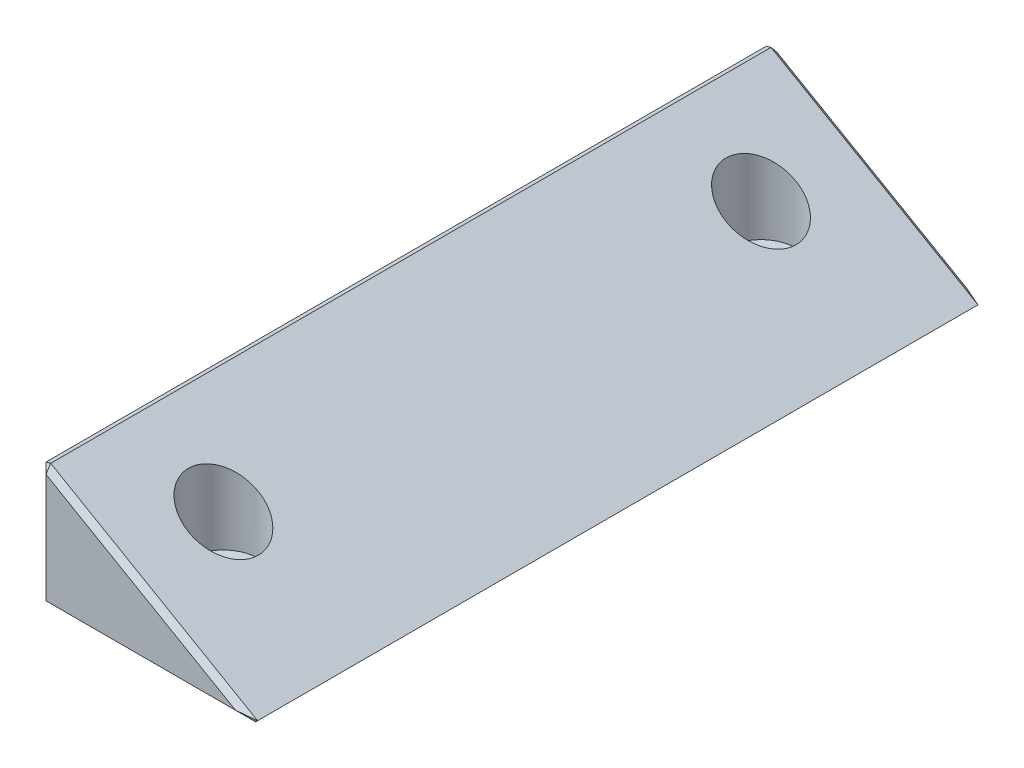
ISO-10303-21;
HEADER;
FILE_DESCRIPTION(('STEP AP214'),'2;1');
FILE_NAME('part.step','',(''),(''),'','','');
FILE_SCHEMA(('AUTOMOTIVE_DESIGN { 1 0 10303 214 1 1 1 1 }'));
ENDSEC;
DATA;
#1=APPLICATION_CONTEXT('core data for automotive mechanical design processes');
#2=APPLICATION_PROTOCOL_DEFINITION('international standard','automotive_design',2000,#1);
#3=PRODUCT_CONTEXT('',#1,'mechanical');
#4=PRODUCT('Part','Part','',(#3));
#5=PRODUCT_RELATED_PRODUCT_CATEGORY('part','',(#4));
#6=PRODUCT_DEFINITION_FORMATION('','',#4);
#7=PRODUCT_DEFINITION_CONTEXT('part definition',#1,'design');
#8=PRODUCT_DEFINITION('design','',#6,#7);
#9=PRODUCT_DEFINITION_SHAPE('','',#8);
#10=(LENGTH_UNIT() NAMED_UNIT(*) SI_UNIT(.MILLI.,.METRE.));
#11=(NAMED_UNIT(*) PLANE_ANGLE_UNIT() SI_UNIT($,.RADIAN.));
#12=(NAMED_UNIT(*) SI_UNIT($,.STERADIAN.) SOLID_ANGLE_UNIT());
#13=UNCERTAINTY_MEASURE_WITH_UNIT(LENGTH_MEASURE(1.E-05),#10,'distance_accuracy_value','');
#14=(GEOMETRIC_REPRESENTATION_CONTEXT(3) GLOBAL_UNCERTAINTY_ASSIGNED_CONTEXT((#13)) GLOBAL_UNIT_ASSIGNED_CONTEXT((#10,
#11,#12)) REPRESENTATION_CONTEXT('',''));
#15=CARTESIAN_POINT('',(0.,0.,0.));
#16=DIRECTION('',(0.,0.,1.));
#17=DIRECTION('',(1.,0.,0.));
#18=AXIS2_PLACEMENT_3D('',#15,#16,#17);
#19=CARTESIAN_POINT('',(20.,-11.5470053837923,34.));
#20=DIRECTION('',(-0.499999999999994,-0.866025403784442,0.));
#21=DIRECTION('',(0.866025403784442,-0.499999999999994,0.));
#22=AXIS2_PLACEMENT_3D('',#19,#20,#21);
#23=PLANE('',#22);
#24=DIRECTION('',(0.,0.,-1.));
#25=VECTOR('',#24,1.);
#26=CARTESIAN_POINT('',(19.6830127018922,-11.3639926819001,34.));
#27=LINE('',#26,#25);
#28=CARTESIAN_POINT('',(19.6830127018922,-11.3639926819001,33.5));
#29=VERTEX_POINT('',#28);
#30=CARTESIAN_POINT('',(19.6830127018922,-11.3639926819001,-33.5));
#31=VERTEX_POINT('',#30);
#32=EDGE_CURVE('E230',#29,#31,#27,.T.);
#33=ORIENTED_EDGE('',*,*,#32,.T.);
#34=DIRECTION('',(-0.866025403784442,0.499999999999994,0.));
#35=VECTOR('',#34,1.);
#36=CARTESIAN_POINT('',(20.,-11.5470053837923,-33.5));
#37=LINE('',#36,#35);
#38=CARTESIAN_POINT('',(0.433012701892221,-0.249999999999995,-33.5));
#39=VERTEX_POINT('',#38);
#40=EDGE_CURVE('E237',#31,#39,#37,.T.);
#41=ORIENTED_EDGE('',*,*,#40,.T.);
#42=DIRECTION('',(0.,0.,1.));
#43=VECTOR('',#42,1.);
#44=CARTESIAN_POINT('',(0.433012701892221,-0.249999999999995,34.));
#45=LINE('',#44,#43);
#46=CARTESIAN_POINT('',(0.433012701892221,-0.249999999999995,33.5));
#47=VERTEX_POINT('',#46);
#48=EDGE_CURVE('E233',#39,#47,#45,.T.);
#49=ORIENTED_EDGE('',*,*,#48,.T.);
#50=DIRECTION('',(0.866025403784442,-0.499999999999994,0.));
#51=VECTOR('',#50,1.);
#52=CARTESIAN_POINT('',(20.,-11.5470053837923,33.5));
#53=LINE('',#52,#51);
#54=EDGE_CURVE('E227',#47,#29,#53,.T.);
#55=ORIENTED_EDGE('',*,*,#54,.T.);
#56=EDGE_LOOP('',(#33,#41,#49,#55));
#57=FACE_BOUND('',#56,.T.);
#58=CARTESIAN_POINT('',(8.,-4.61880215351693,25.));
#59=DIRECTION('',(-0.499999999999994,-0.866025403784442,0.));
#60=DIRECTION('',(-0.866025403784442,0.499999999999994,0.));
#61=AXIS2_PLACEMENT_3D('',#58,#59,#60);
#62=ELLIPSE('',#61,3.75277674973255,3.25);
#63=CARTESIAN_POINT('',(4.75,-2.74241377865068,25.));
#64=VERTEX_POINT('',#63);
#65=EDGE_CURVE('E206',#64,#64,#62,.T.);
#66=ORIENTED_EDGE('',*,*,#65,.T.);
#67=EDGE_LOOP('',(#66));
#68=FACE_BOUND('',#67,.T.);
#69=CARTESIAN_POINT('',(8.,-4.61880215351693,-25.));
#70=DIRECTION('',(-0.499999999999994,-0.866025403784442,0.));
#71=DIRECTION('',(-0.866025403784442,0.499999999999994,0.));
#72=AXIS2_PLACEMENT_3D('',#69,#70,#71);
#73=ELLIPSE('',#72,3.75277674973255,3.25);
#74=CARTESIAN_POINT('',(4.75,-2.74241377865068,-25.));
#75=VERTEX_POINT('',#74);
#76=EDGE_CURVE('E143',#75,#75,#73,.T.);
#77=ORIENTED_EDGE('',*,*,#76,.T.);
#78=EDGE_LOOP('',(#77));
#79=FACE_BOUND('',#78,.T.);
#80=ADVANCED_FACE('F43',(#57,#68,#79),#23,.F.);
#81=CARTESIAN_POINT('',(0.,0.,34.));
#82=DIRECTION('',(1.,0.,0.));
#83=DIRECTION('',(0.,0.,-1.));
#84=AXIS2_PLACEMENT_3D('',#81,#82,#83);
#85=PLANE('',#84);
#86=DIRECTION('',(0.,1.,0.));
#87=VECTOR('',#86,1.);
#88=CARTESIAN_POINT('',(0.,0.,33.5));
#89=LINE('',#88,#87);
#90=CARTESIAN_POINT('',(0.,-11.0470053837923,33.5));
#91=VERTEX_POINT('',#90);
#92=CARTESIAN_POINT('',(0.,-0.366025403784432,33.5));
#93=VERTEX_POINT('',#92);
#94=EDGE_CURVE('E130',#91,#93,#89,.T.);
#95=ORIENTED_EDGE('',*,*,#94,.T.);
#96=DIRECTION('',(0.,0.,-1.));
#97=VECTOR('',#96,1.);
#98=CARTESIAN_POINT('',(0.,-0.366025403784432,34.));
#99=LINE('',#98,#97);
#100=CARTESIAN_POINT('',(0.,-0.366025403784432,-33.5));
#101=VERTEX_POINT('',#100);
#102=EDGE_CURVE('E126',#93,#101,#99,.T.);
#103=ORIENTED_EDGE('',*,*,#102,.T.);
#104=DIRECTION('',(0.,-1.,0.));
#105=VECTOR('',#104,1.);
#106=CARTESIAN_POINT('',(0.,0.,-33.5));
#107=LINE('',#106,#105);
#108=CARTESIAN_POINT('',(0.,-11.0470053837923,-33.5));
#109=VERTEX_POINT('',#108);
#110=EDGE_CURVE('E120',#101,#109,#107,.T.);
#111=ORIENTED_EDGE('',*,*,#110,.T.);
#112=DIRECTION('',(0.,0.,1.));
#113=VECTOR('',#112,1.);
#114=CARTESIAN_POINT('',(0.,-11.0470053837923,34.));
#115=LINE('',#114,#113);
#116=EDGE_CURVE('E123',#109,#91,#115,.T.);
#117=ORIENTED_EDGE('',*,*,#116,.T.);
#118=EDGE_LOOP('',(#95,#103,#111,#117));
#119=FACE_BOUND('',#118,.T.);
#120=ADVANCED_FACE('F122',(#119),#85,.F.);
#121=CARTESIAN_POINT('',(0.,-11.5470053837923,34.));
#122=DIRECTION('',(0.,1.,0.));
#123=DIRECTION('',(0.,0.,1.));
#124=AXIS2_PLACEMENT_3D('',#121,#122,#123);
#125=PLANE('',#124);
#126=CARTESIAN_POINT('',(8.,-11.5470053837923,-25.));
#127=DIRECTION('',(0.,1.,0.));
#128=DIRECTION('',(0.,0.,1.));
#129=AXIS2_PLACEMENT_3D('',#126,#127,#128);
#130=CIRCLE('',#129,2.2);
#131=CARTESIAN_POINT('',(8.,-11.5470053837923,-22.8));
#132=VERTEX_POINT('',#131);
#133=EDGE_CURVE('E257',#132,#132,#130,.T.);
#134=ORIENTED_EDGE('',*,*,#133,.T.);
#135=EDGE_LOOP('',(#134));
#136=FACE_BOUND('',#135,.T.);
#137=CARTESIAN_POINT('',(8.,-11.5470053837923,25.));
#138=DIRECTION('',(0.,1.,0.));
#139=DIRECTION('',(0.,0.,1.));
#140=AXIS2_PLACEMENT_3D('',#137,#138,#139);
#141=CIRCLE('',#140,2.2);
#142=CARTESIAN_POINT('',(8.,-11.5470053837923,27.2));
#143=VERTEX_POINT('',#142);
#144=EDGE_CURVE('E253',#143,#143,#141,.T.);
#145=ORIENTED_EDGE('',*,*,#144,.T.);
#146=EDGE_LOOP('',(#145));
#147=FACE_BOUND('',#146,.T.);
#148=DIRECTION('',(1.,0.,0.));
#149=VECTOR('',#148,1.);
#150=CARTESIAN_POINT('',(0.,-11.5470053837923,-33.5));
#151=LINE('',#150,#149);
#152=CARTESIAN_POINT('',(0.5,-11.5470053837923,-33.5));
#153=VERTEX_POINT('',#152);
#154=CARTESIAN_POINT('',(19.5,-11.5470053837923,-33.5));
#155=VERTEX_POINT('',#154);
#156=EDGE_CURVE('E246',#153,#155,#151,.T.);
#157=ORIENTED_EDGE('',*,*,#156,.T.);
#158=DIRECTION('',(0.,0.,1.));
#159=VECTOR('',#158,1.);
#160=CARTESIAN_POINT('',(19.5,-11.5470053837923,34.));
#161=LINE('',#160,#159);
#162=CARTESIAN_POINT('',(19.5,-11.5470053837923,33.5));
#163=VERTEX_POINT('',#162);
#164=EDGE_CURVE('E249',#155,#163,#161,.T.);
#165=ORIENTED_EDGE('',*,*,#164,.T.);
#166=DIRECTION('',(-1.,0.,0.));
#167=VECTOR('',#166,1.);
#168=CARTESIAN_POINT('',(0.,-11.5470053837923,33.5));
#169=LINE('',#168,#167);
#170=CARTESIAN_POINT('',(0.5,-11.5470053837923,33.5));
#171=VERTEX_POINT('',#170);
#172=EDGE_CURVE('E240',#163,#171,#169,.T.);
#173=ORIENTED_EDGE('',*,*,#172,.T.);
#174=DIRECTION('',(0.,0.,-1.));
#175=VECTOR('',#174,1.);
#176=CARTESIAN_POINT('',(0.5,-11.5470053837923,34.));
#177=LINE('',#176,#175);
#178=EDGE_CURVE('E243',#171,#153,#177,.T.);
#179=ORIENTED_EDGE('',*,*,#178,.T.);
#180=EDGE_LOOP('',(#157,#165,#173,#179));
#181=FACE_BOUND('',#180,.T.);
#182=ADVANCED_FACE('F334',(#136,#147,#181),#125,.F.);
#183=CARTESIAN_POINT('',(0.,0.,34.));
#184=DIRECTION('',(0.,0.,1.));
#185=DIRECTION('',(1.,0.,0.));
#186=AXIS2_PLACEMENT_3D('',#183,#184,#185);
#187=PLANE('',#186);
#188=DIRECTION('',(-0.866025403784442,0.499999999999995,0.));
#189=VECTOR('',#188,1.);
#190=CARTESIAN_POINT('',(-0.249999999999997,-0.43301270189222,34.));
#191=LINE('',#190,#189);
#192=CARTESIAN_POINT('',(18.1339745962155,-11.0470053837923,34.));
#193=VERTEX_POINT('',#192);
#194=CARTESIAN_POINT('',(0.5,-0.866025403784431,34.));
#195=VERTEX_POINT('',#194);
#196=EDGE_CURVE('E269',#193,#195,#191,.T.);
#197=ORIENTED_EDGE('',*,*,#196,.T.);
#198=DIRECTION('',(0.,-1.,0.));
#199=VECTOR('',#198,1.);
#200=CARTESIAN_POINT('',(0.5,-11.5470053837923,34.));
#201=LINE('',#200,#199);
#202=CARTESIAN_POINT('',(0.5,-11.0470053837923,34.));
#203=VERTEX_POINT('',#202);
#204=EDGE_CURVE('E275',#195,#203,#201,.T.);
#205=ORIENTED_EDGE('',*,*,#204,.T.);
#206=DIRECTION('',(1.,0.,0.));
#207=VECTOR('',#206,1.);
#208=CARTESIAN_POINT('',(20.,-11.0470053837923,34.));
#209=LINE('',#208,#207);
#210=EDGE_CURVE('E272',#203,#193,#209,.T.);
#211=ORIENTED_EDGE('',*,*,#210,.T.);
#212=EDGE_LOOP('',(#197,#205,#211));
#213=FACE_BOUND('',#212,.T.);
#214=ADVANCED_FACE('F324',(#213),#187,.T.);
#215=CARTESIAN_POINT('',(0.,0.,-34.));
#216=DIRECTION('',(0.,0.,1.));
#217=DIRECTION('',(1.,0.,0.));
#218=AXIS2_PLACEMENT_3D('',#215,#216,#217);
#219=PLANE('',#218);
#220=DIRECTION('',(-1.,0.,0.));
#221=VECTOR('',#220,1.);
#222=CARTESIAN_POINT('',(0.,-11.0470053837923,-34.));
#223=LINE('',#222,#221);
#224=CARTESIAN_POINT('',(18.1339745962155,-11.0470053837923,-34.));
#225=VERTEX_POINT('',#224);
#226=CARTESIAN_POINT('',(0.5,-11.0470053837923,-34.));
#227=VERTEX_POINT('',#226);
#228=EDGE_CURVE('E69',#225,#227,#223,.T.);
#229=ORIENTED_EDGE('',*,*,#228,.T.);
#230=DIRECTION('',(0.,1.,0.));
#231=VECTOR('',#230,1.);
#232=CARTESIAN_POINT('',(0.5,0.,-34.));
#233=LINE('',#232,#231);
#234=CARTESIAN_POINT('',(0.5,-0.866025403784429,-34.));
#235=VERTEX_POINT('',#234);
#236=EDGE_CURVE('E11',#227,#235,#233,.T.);
#237=ORIENTED_EDGE('',*,*,#236,.T.);
#238=DIRECTION('',(0.866025403784442,-0.499999999999995,0.));
#239=VECTOR('',#238,1.);
#240=CARTESIAN_POINT('',(-0.249999999999996,-0.433012701892218,-34.));
#241=LINE('',#240,#239);
#242=EDGE_CURVE('E54',#235,#225,#241,.T.);
#243=ORIENTED_EDGE('',*,*,#242,.T.);
#244=EDGE_LOOP('',(#229,#237,#243));
#245=FACE_BOUND('',#244,.T.);
#246=ADVANCED_FACE('F321',(#245),#219,.F.);
#247=CARTESIAN_POINT('',(8.,0.,-25.));
#248=DIRECTION('',(0.,1.,0.));
#249=DIRECTION('',(0.,0.,1.));
#250=AXIS2_PLACEMENT_3D('',#247,#248,#249);
#251=CYLINDRICAL_SURFACE('',#250,3.25);
#252=CARTESIAN_POINT('',(8.,-10.,-25.));
#253=DIRECTION('',(0.,1.,0.));
#254=DIRECTION('',(0.,0.,1.));
#255=AXIS2_PLACEMENT_3D('',#252,#253,#254);
#256=CIRCLE('',#255,3.25);
#257=CARTESIAN_POINT('',(8.,-10.,-21.75));
#258=VERTEX_POINT('',#257);
#259=EDGE_CURVE('E209',#258,#258,#256,.T.);
#260=ORIENTED_EDGE('',*,*,#259,.F.);
#261=EDGE_LOOP('',(#260));
#262=FACE_BOUND('',#261,.T.);
#263=ORIENTED_EDGE('',*,*,#76,.F.);
#264=EDGE_LOOP('',(#263));
#265=FACE_BOUND('',#264,.T.);
#266=ADVANCED_FACE('F323',(#262,#265),#251,.F.);
#267=CARTESIAN_POINT('',(8.,0.,-25.));
#268=DIRECTION('',(0.,1.,0.));
#269=DIRECTION('',(0.,0.,1.));
#270=AXIS2_PLACEMENT_3D('',#267,#268,#269);
#271=CYLINDRICAL_SURFACE('',#270,1.7);
#272=CARTESIAN_POINT('',(8.,-11.0470053837923,-25.));
#273=DIRECTION('',(0.,1.,0.));
#274=DIRECTION('',(0.,0.,1.));
#275=AXIS2_PLACEMENT_3D('',#272,#273,#274);
#276=CIRCLE('',#275,1.7);
#277=CARTESIAN_POINT('',(8.,-11.0470053837923,-23.3));
#278=VERTEX_POINT('',#277);
#279=EDGE_CURVE('E261',#278,#278,#276,.F.);
#280=ORIENTED_EDGE('',*,*,#279,.T.);
#281=EDGE_LOOP('',(#280));
#282=FACE_BOUND('',#281,.T.);
#283=CARTESIAN_POINT('',(8.,-10.,-25.));
#284=DIRECTION('',(0.,1.,0.));
#285=DIRECTION('',(0.,0.,1.));
#286=AXIS2_PLACEMENT_3D('',#283,#284,#285);
#287=CIRCLE('',#286,1.7);
#288=CARTESIAN_POINT('',(8.,-10.,-23.3));
#289=VERTEX_POINT('',#288);
#290=EDGE_CURVE('E213',#289,#289,#287,.T.);
#291=ORIENTED_EDGE('',*,*,#290,.T.);
#292=EDGE_LOOP('',(#291));
#293=FACE_BOUND('',#292,.T.);
#294=ADVANCED_FACE('F331',(#282,#293),#271,.F.);
#295=CARTESIAN_POINT('',(9.69999999999999,-10.,-25.));
#296=DIRECTION('',(0.,-1.,0.));
#297=DIRECTION('',(0.,0.,-1.));
#298=AXIS2_PLACEMENT_3D('',#295,#296,#297);
#299=PLANE('',#298);
#300=ORIENTED_EDGE('',*,*,#290,.F.);
#301=EDGE_LOOP('',(#300));
#302=FACE_BOUND('',#301,.T.);
#303=ORIENTED_EDGE('',*,*,#259,.T.);
#304=EDGE_LOOP('',(#303));
#305=FACE_BOUND('',#304,.T.);
#306=ADVANCED_FACE('F487',(#302,#305),#299,.F.);
#307=CARTESIAN_POINT('',(8.,0.,25.));
#308=DIRECTION('',(0.,1.,0.));
#309=DIRECTION('',(0.,0.,1.));
#310=AXIS2_PLACEMENT_3D('',#307,#308,#309);
#311=CYLINDRICAL_SURFACE('',#310,3.25);
#312=CARTESIAN_POINT('',(8.,-10.,25.));
#313=DIRECTION('',(0.,1.,0.));
#314=DIRECTION('',(0.,0.,1.));
#315=AXIS2_PLACEMENT_3D('',#312,#313,#314);
#316=CIRCLE('',#315,3.25);
#317=CARTESIAN_POINT('',(8.,-10.,28.25));
#318=VERTEX_POINT('',#317);
#319=EDGE_CURVE('E195',#318,#318,#316,.T.);
#320=ORIENTED_EDGE('',*,*,#319,.F.);
#321=EDGE_LOOP('',(#320));
#322=FACE_BOUND('',#321,.T.);
#323=ORIENTED_EDGE('',*,*,#65,.F.);
#324=EDGE_LOOP('',(#323));
#325=FACE_BOUND('',#324,.T.);
#326=ADVANCED_FACE('F497',(#322,#325),#311,.F.);
#327=CARTESIAN_POINT('',(8.,0.,25.));
#328=DIRECTION('',(0.,1.,0.));
#329=DIRECTION('',(0.,0.,1.));
#330=AXIS2_PLACEMENT_3D('',#327,#328,#329);
#331=CYLINDRICAL_SURFACE('',#330,1.7);
#332=CARTESIAN_POINT('',(8.,-11.0470053837923,25.));
#333=DIRECTION('',(0.,1.,0.));
#334=DIRECTION('',(0.,0.,1.));
#335=AXIS2_PLACEMENT_3D('',#332,#333,#334);
#336=CIRCLE('',#335,1.7);
#337=CARTESIAN_POINT('',(8.,-11.0470053837923,26.7));
#338=VERTEX_POINT('',#337);
#339=EDGE_CURVE('E265',#338,#338,#336,.F.);
#340=ORIENTED_EDGE('',*,*,#339,.T.);
#341=EDGE_LOOP('',(#340));
#342=FACE_BOUND('',#341,.T.);
#343=CARTESIAN_POINT('',(8.,-10.,25.));
#344=DIRECTION('',(0.,1.,0.));
#345=DIRECTION('',(0.,0.,1.));
#346=AXIS2_PLACEMENT_3D('',#343,#344,#345);
#347=CIRCLE('',#346,1.7);
#348=CARTESIAN_POINT('',(8.,-10.,26.7));
#349=VERTEX_POINT('',#348);
#350=EDGE_CURVE('E199',#349,#349,#347,.T.);
#351=ORIENTED_EDGE('',*,*,#350,.T.);
#352=EDGE_LOOP('',(#351));
#353=FACE_BOUND('',#352,.T.);
#354=ADVANCED_FACE('F507',(#342,#353),#331,.F.);
#355=CARTESIAN_POINT('',(9.69999999999999,-10.,25.));
#356=DIRECTION('',(0.,-1.,0.));
#357=DIRECTION('',(0.,0.,-1.));
#358=AXIS2_PLACEMENT_3D('',#355,#356,#357);
#359=PLANE('',#358);
#360=ORIENTED_EDGE('',*,*,#350,.F.);
#361=EDGE_LOOP('',(#360));
#362=FACE_BOUND('',#361,.T.);
#363=ORIENTED_EDGE('',*,*,#319,.T.);
#364=EDGE_LOOP('',(#363));
#365=FACE_BOUND('',#364,.T.);
#366=ADVANCED_FACE('F430',(#362,#365),#359,.F.);
#367=CARTESIAN_POINT('',(0.,-11.0470053837923,34.));
#368=DIRECTION('',(0.,-0.707106781186547,0.707106781186547));
#369=DIRECTION('',(-1.,0.,0.));
#370=AXIS2_PLACEMENT_3D('',#367,#368,#369);
#371=PLANE('',#370);
#372=DIRECTION('',(0.,0.707106781186547,0.707106781186547));
#373=VECTOR('',#372,1.);
#374=CARTESIAN_POINT('',(0.5,-11.0470053837923,34.));
#375=LINE('',#374,#373);
#376=EDGE_CURVE('E183',#171,#203,#375,.T.);
#377=ORIENTED_EDGE('',*,*,#376,.F.);
#378=ORIENTED_EDGE('',*,*,#172,.F.);
#379=DIRECTION('',(0.888073833977116,-0.325057583671867,-0.325057583671867));
#380=VECTOR('',#379,1.);
#381=CARTESIAN_POINT('',(19.5,-11.5470053837923,33.5));
#382=LINE('',#381,#380);
#383=EDGE_CURVE('E186',#193,#163,#382,.T.);
#384=ORIENTED_EDGE('',*,*,#383,.F.);
#385=ORIENTED_EDGE('',*,*,#210,.F.);
#386=EDGE_LOOP('',(#377,#378,#384,#385));
#387=FACE_BOUND('',#386,.T.);
#388=ADVANCED_FACE('F426',(#387),#371,.T.);
#389=CARTESIAN_POINT('',(0.5,-11.5470053837923,34.));
#390=DIRECTION('',(0.707106781186548,0.707106781186547,0.));
#391=DIRECTION('',(0.,0.,-1.));
#392=AXIS2_PLACEMENT_3D('',#389,#390,#391);
#393=PLANE('',#392);
#394=DIRECTION('',(0.707106781186547,-0.707106781186547,0.));
#395=VECTOR('',#394,1.);
#396=CARTESIAN_POINT('',(0.,-11.0470053837923,-33.5));
#397=LINE('',#396,#395);
#398=EDGE_CURVE('E137',#153,#109,#397,.F.);
#399=ORIENTED_EDGE('',*,*,#398,.F.);
#400=ORIENTED_EDGE('',*,*,#178,.F.);
#401=DIRECTION('',(-0.707106781186547,0.707106781186548,0.));
#402=VECTOR('',#401,1.);
#403=CARTESIAN_POINT('',(0.25,-11.2970053837923,33.5));
#404=LINE('',#403,#402);
#405=EDGE_CURVE('E140',#91,#171,#404,.F.);
#406=ORIENTED_EDGE('',*,*,#405,.F.);
#407=ORIENTED_EDGE('',*,*,#116,.F.);
#408=EDGE_LOOP('',(#399,#400,#406,#407));
#409=FACE_BOUND('',#408,.T.);
#410=ADVANCED_FACE('F135',(#409),#393,.F.);
#411=CARTESIAN_POINT('',(0.,-11.5470053837923,-33.5));
#412=DIRECTION('',(0.,0.707106781186547,0.707106781186547));
#413=DIRECTION('',(1.,0.,0.));
#414=AXIS2_PLACEMENT_3D('',#411,#412,#413);
#415=PLANE('',#414);
#416=DIRECTION('',(0.888073833977116,-0.325057583671868,0.325057583671868));
#417=VECTOR('',#416,1.);
#418=CARTESIAN_POINT('',(19.5915063509461,-11.5804990328462,-33.4665063509461));
#419=LINE('',#418,#417);
#420=EDGE_CURVE('E175',#155,#225,#419,.F.);
#421=ORIENTED_EDGE('',*,*,#420,.F.);
#422=ORIENTED_EDGE('',*,*,#156,.F.);
#423=DIRECTION('',(0.,0.707106781186548,-0.707106781186548));
#424=VECTOR('',#423,1.);
#425=CARTESIAN_POINT('',(0.5,-11.2970053837923,-33.75));
#426=LINE('',#425,#424);
#427=EDGE_CURVE('E150',#227,#153,#426,.F.);
#428=ORIENTED_EDGE('',*,*,#427,.F.);
#429=ORIENTED_EDGE('',*,*,#228,.F.);
#430=EDGE_LOOP('',(#421,#422,#428,#429));
#431=FACE_BOUND('',#430,.T.);
#432=ADVANCED_FACE('F413',(#431),#415,.F.);
#433=CARTESIAN_POINT('',(19.6830127018922,-11.3639926819001,34.));
#434=DIRECTION('',(-0.707106781186561,0.707106781186534,0.));
#435=DIRECTION('',(0.,0.,-1.));
#436=AXIS2_PLACEMENT_3D('',#433,#434,#435);
#437=PLANE('',#436);
#438=DIRECTION('',(-0.707106781186534,-0.707106781186561,0.));
#439=VECTOR('',#438,1.);
#440=CARTESIAN_POINT('',(19.5,-11.5470053837923,33.5));
#441=LINE('',#440,#439);
#442=EDGE_CURVE('E48',#163,#29,#441,.F.);
#443=ORIENTED_EDGE('',*,*,#442,.F.);
#444=ORIENTED_EDGE('',*,*,#164,.F.);
#445=DIRECTION('',(0.707106781186534,0.707106781186561,0.));
#446=VECTOR('',#445,1.);
#447=CARTESIAN_POINT('',(19.6830127018922,-11.3639926819001,-33.5));
#448=LINE('',#447,#446);
#449=EDGE_CURVE('E171',#31,#155,#448,.F.);
#450=ORIENTED_EDGE('',*,*,#449,.F.);
#451=ORIENTED_EDGE('',*,*,#32,.F.);
#452=EDGE_LOOP('',(#443,#444,#450,#451));
#453=FACE_BOUND('',#452,.T.);
#454=ADVANCED_FACE('F407',(#453),#437,.F.);
#455=CARTESIAN_POINT('',(19.5,-11.5470053837923,33.5));
#456=DIRECTION('',(0.250562807085734,-0.250562807085724,0.935113126531031));
#457=DIRECTION('',(0.965925826289068,0.,-0.258819045102522));
#458=AXIS2_PLACEMENT_3D('',#455,#456,#457);
#459=PLANE('',#458);
#460=ORIENTED_EDGE('',*,*,#383,.T.);
#461=ORIENTED_EDGE('',*,*,#442,.T.);
#462=DIRECTION('',(-0.934105124089523,0.191150532933094,0.301511344577763));
#463=VECTOR('',#462,1.);
#464=CARTESIAN_POINT('',(19.5560023094349,-11.3380019196399,33.5409965358476));
#465=LINE('',#464,#463);
#466=EDGE_CURVE('E161',#193,#29,#465,.F.);
#467=ORIENTED_EDGE('',*,*,#466,.F.);
#468=EDGE_LOOP('',(#460,#461,#467));
#469=FACE_BOUND('',#468,.T.);
#470=ADVANCED_FACE('F401',(#469),#459,.T.);
#471=CARTESIAN_POINT('',(0.5,-11.0470053837923,34.));
#472=DIRECTION('',(-0.577350269189626,-0.577350269189626,0.577350269189626));
#473=DIRECTION('',(0.707106781186547,0.,0.707106781186548));
#474=AXIS2_PLACEMENT_3D('',#471,#472,#473);
#475=PLANE('',#474);
#476=ORIENTED_EDGE('',*,*,#405,.T.);
#477=ORIENTED_EDGE('',*,*,#376,.T.);
#478=DIRECTION('',(-0.707106781186547,0.,-0.707106781186548));
#479=VECTOR('',#478,1.);
#480=CARTESIAN_POINT('',(0.5,-11.0470053837923,34.));
#481=LINE('',#480,#479);
#482=EDGE_CURVE('E155',#91,#203,#481,.F.);
#483=ORIENTED_EDGE('',*,*,#482,.F.);
#484=EDGE_LOOP('',(#476,#477,#483));
#485=FACE_BOUND('',#484,.T.);
#486=ADVANCED_FACE('F395',(#485),#475,.T.);
#487=CARTESIAN_POINT('',(0.,-11.0470053837923,-33.5));
#488=DIRECTION('',(-0.577350269189626,-0.577350269189626,-0.577350269189626));
#489=DIRECTION('',(-0.707106781186548,0.,0.707106781186548));
#490=AXIS2_PLACEMENT_3D('',#487,#488,#489);
#491=PLANE('',#490);
#492=ORIENTED_EDGE('',*,*,#427,.T.);
#493=ORIENTED_EDGE('',*,*,#398,.T.);
#494=DIRECTION('',(-0.707106781186548,0.,0.707106781186548));
#495=VECTOR('',#494,1.);
#496=CARTESIAN_POINT('',(0.,-11.0470053837923,-33.5));
#497=LINE('',#496,#495);
#498=EDGE_CURVE('E148',#227,#109,#497,.T.);
#499=ORIENTED_EDGE('',*,*,#498,.F.);
#500=EDGE_LOOP('',(#492,#493,#499));
#501=FACE_BOUND('',#500,.T.);
#502=ADVANCED_FACE('F147',(#501),#491,.T.);
#503=CARTESIAN_POINT('',(19.6830127018922,-11.3639926819001,-33.5));
#504=DIRECTION('',(0.250562807085734,-0.250562807085725,-0.935113126531031));
#505=DIRECTION('',(-0.965925826289068,0.,-0.258819045102523));
#506=AXIS2_PLACEMENT_3D('',#503,#504,#505);
#507=PLANE('',#506);
#508=ORIENTED_EDGE('',*,*,#449,.T.);
#509=ORIENTED_EDGE('',*,*,#420,.T.);
#510=DIRECTION('',(-0.934105124089523,0.191150532933093,-0.301511344577763));
#511=VECTOR('',#510,1.);
#512=CARTESIAN_POINT('',(19.6830127018922,-11.3639926819001,-33.5));
#513=LINE('',#512,#511);
#514=EDGE_CURVE('E156',#31,#225,#513,.T.);
#515=ORIENTED_EDGE('',*,*,#514,.F.);
#516=EDGE_LOOP('',(#508,#509,#515));
#517=FACE_BOUND('',#516,.T.);
#518=ADVANCED_FACE('F384',(#517),#507,.T.);
#519=CARTESIAN_POINT('',(-0.249999999999997,-0.43301270189222,34.));
#520=DIRECTION('',(0.35355339059327,0.612372435695797,0.707106781186547));
#521=DIRECTION('',(0.866025403784442,-0.499999999999994,0.));
#522=AXIS2_PLACEMENT_3D('',#519,#520,#521);
#523=PLANE('',#522);
#524=ORIENTED_EDGE('',*,*,#466,.T.);
#525=ORIENTED_EDGE('',*,*,#54,.F.);
#526=DIRECTION('',(-0.0841310934092844,0.773682358480759,-0.627963030199557));
#527=VECTOR('',#526,1.);
#528=CARTESIAN_POINT('',(0.433012701892221,-0.249999999999995,33.5));
#529=LINE('',#528,#527);
#530=EDGE_CURVE('E164',#195,#47,#529,.T.);
#531=ORIENTED_EDGE('',*,*,#530,.F.);
#532=ORIENTED_EDGE('',*,*,#196,.F.);
#533=EDGE_LOOP('',(#524,#525,#531,#532));
#534=FACE_BOUND('',#533,.T.);
#535=ADVANCED_FACE('F308',(#534),#523,.T.);
#536=CARTESIAN_POINT('',(0.5,0.,34.));
#537=DIRECTION('',(-0.707106781186548,0.,0.707106781186547));
#538=DIRECTION('',(0.,1.,0.));
#539=AXIS2_PLACEMENT_3D('',#536,#537,#538);
#540=PLANE('',#539);
#541=ORIENTED_EDGE('',*,*,#482,.T.);
#542=ORIENTED_EDGE('',*,*,#204,.F.);
#543=DIRECTION('',(0.577350269189626,-0.577350269189625,0.577350269189626));
#544=VECTOR('',#543,1.);
#545=CARTESIAN_POINT('',(0.105662432702595,-0.471687836487026,33.6056624327026));
#546=LINE('',#545,#544);
#547=EDGE_CURVE('E294',#93,#195,#546,.T.);
#548=ORIENTED_EDGE('',*,*,#547,.F.);
#549=ORIENTED_EDGE('',*,*,#94,.F.);
#550=EDGE_LOOP('',(#541,#542,#548,#549));
#551=FACE_BOUND('',#550,.T.);
#552=ADVANCED_FACE('F372',(#551),#540,.T.);
#553=CARTESIAN_POINT('',(0.,0.,-33.5));
#554=DIRECTION('',(0.707106781186547,0.,0.707106781186547));
#555=DIRECTION('',(0.,-1.,0.));
#556=AXIS2_PLACEMENT_3D('',#553,#554,#555);
#557=PLANE('',#556);
#558=ORIENTED_EDGE('',*,*,#498,.T.);
#559=ORIENTED_EDGE('',*,*,#110,.F.);
#560=DIRECTION('',(0.577350269189627,-0.577350269189623,-0.577350269189627));
#561=VECTOR('',#560,1.);
#562=CARTESIAN_POINT('',(0.,-0.366025403784432,-33.5));
#563=LINE('',#562,#561);
#564=EDGE_CURVE('E291',#235,#101,#563,.F.);
#565=ORIENTED_EDGE('',*,*,#564,.F.);
#566=ORIENTED_EDGE('',*,*,#236,.F.);
#567=EDGE_LOOP('',(#558,#559,#565,#566));
#568=FACE_BOUND('',#567,.T.);
#569=ADVANCED_FACE('F153',(#568),#557,.F.);
#570=CARTESIAN_POINT('',(20.,-11.5470053837923,-33.5));
#571=DIRECTION('',(-0.35355339059327,-0.612372435695797,0.707106781186547));
#572=DIRECTION('',(-0.866025403784442,0.499999999999994,0.));
#573=AXIS2_PLACEMENT_3D('',#570,#571,#572);
#574=PLANE('',#573);
#575=ORIENTED_EDGE('',*,*,#514,.T.);
#576=ORIENTED_EDGE('',*,*,#242,.F.);
#577=DIRECTION('',(-0.0841310934092819,0.773682358480758,0.627963030199557));
#578=VECTOR('',#577,1.);
#579=CARTESIAN_POINT('',(0.437499999999999,-0.291265877365269,-33.5334936490539));
#580=LINE('',#579,#578);
#581=EDGE_CURVE('E62',#39,#235,#580,.F.);
#582=ORIENTED_EDGE('',*,*,#581,.F.);
#583=ORIENTED_EDGE('',*,*,#40,.F.);
#584=EDGE_LOOP('',(#575,#576,#582,#583));
#585=FACE_BOUND('',#584,.T.);
#586=ADVANCED_FACE('F319',(#585),#574,.F.);
#587=CARTESIAN_POINT('',(0.433012701892221,-0.249999999999995,33.5));
#588=DIRECTION('',(-0.16369153687076,0.610905132370723,0.774596669241482));
#589=DIRECTION('',(0.,-0.785187616240947,0.619257948921013));
#590=AXIS2_PLACEMENT_3D('',#587,#588,#589);
#591=PLANE('',#590);
#592=ORIENTED_EDGE('',*,*,#547,.T.);
#593=ORIENTED_EDGE('',*,*,#530,.T.);
#594=DIRECTION('',(0.96592582628907,0.258819045102515,0.));
#595=VECTOR('',#594,1.);
#596=CARTESIAN_POINT('',(0.433012701892221,-0.249999999999995,33.5));
#597=LINE('',#596,#595);
#598=EDGE_CURVE('E286',#93,#47,#597,.T.);
#599=ORIENTED_EDGE('',*,*,#598,.F.);
#600=EDGE_LOOP('',(#592,#593,#599));
#601=FACE_BOUND('',#600,.T.);
#602=ADVANCED_FACE('F304',(#601),#591,.T.);
#603=CARTESIAN_POINT('',(0.,-0.366025403784432,-33.5));
#604=DIRECTION('',(-0.16369153687076,0.610905132370725,-0.774596669241481));
#605=DIRECTION('',(0.,0.785187616240946,0.619257948921014));
#606=AXIS2_PLACEMENT_3D('',#603,#604,#605);
#607=PLANE('',#606);
#608=ORIENTED_EDGE('',*,*,#581,.T.);
#609=ORIENTED_EDGE('',*,*,#564,.T.);
#610=DIRECTION('',(-0.96592582628907,-0.258819045102515,0.));
#611=VECTOR('',#610,1.);
#612=CARTESIAN_POINT('',(0.,-0.366025403784432,-33.5));
#613=LINE('',#612,#611);
#614=EDGE_CURVE('E283',#39,#101,#613,.T.);
#615=ORIENTED_EDGE('',*,*,#614,.F.);
#616=EDGE_LOOP('',(#608,#609,#615));
#617=FACE_BOUND('',#616,.T.);
#618=ADVANCED_FACE('F316',(#617),#607,.T.);
#619=CARTESIAN_POINT('',(0.,-0.366025403784432,34.));
#620=DIRECTION('',(0.258819045102515,-0.96592582628907,0.));
#621=DIRECTION('',(0.,0.,-1.));
#622=AXIS2_PLACEMENT_3D('',#619,#620,#621);
#623=PLANE('',#622);
#624=ORIENTED_EDGE('',*,*,#598,.T.);
#625=ORIENTED_EDGE('',*,*,#48,.F.);
#626=ORIENTED_EDGE('',*,*,#614,.T.);
#627=ORIENTED_EDGE('',*,*,#102,.F.);
#628=EDGE_LOOP('',(#624,#625,#626,#627));
#629=FACE_BOUND('',#628,.T.);
#630=ADVANCED_FACE('F315',(#629),#623,.F.);
#631=CARTESIAN_POINT('',(8.,-11.5470053837923,-25.));
#632=DIRECTION('',(0.,-1.,0.));
#633=DIRECTION('',(0.,0.,-1.));
#634=AXIS2_PLACEMENT_3D('',#631,#632,#633);
#635=CONICAL_SURFACE('',#634,2.2,0.785398163397452);
#636=ORIENTED_EDGE('',*,*,#279,.F.);
#637=EDGE_LOOP('',(#636));
#638=FACE_BOUND('',#637,.T.);
#639=ORIENTED_EDGE('',*,*,#133,.F.);
#640=EDGE_LOOP('',(#639));
#641=FACE_BOUND('',#640,.T.);
#642=ADVANCED_FACE('F353',(#638,#641),#635,.F.);
#643=CARTESIAN_POINT('',(8.,-11.5470053837923,25.));
#644=DIRECTION('',(0.,-1.,0.));
#645=DIRECTION('',(0.,0.,-1.));
#646=AXIS2_PLACEMENT_3D('',#643,#644,#645);
#647=CONICAL_SURFACE('',#646,2.2,0.785398163397452);
#648=ORIENTED_EDGE('',*,*,#339,.F.);
#649=EDGE_LOOP('',(#648));
#650=FACE_BOUND('',#649,.T.);
#651=ORIENTED_EDGE('',*,*,#144,.F.);
#652=EDGE_LOOP('',(#651));
#653=FACE_BOUND('',#652,.T.);
#654=ADVANCED_FACE('F46',(#650,#653),#647,.F.);
#655=CLOSED_SHELL('',(#80,#120,#182,#214,#246,#266,#294,#306,#326,#354,#366,#388,#410,#432,#454,
#470,#486,#502,#518,#535,#552,#569,#586,#602,#618,#630,#642,#654));
#656=MANIFOLD_SOLID_BREP('B2',#655);
#657=ADVANCED_BREP_SHAPE_REPRESENTATION('',(#18,#656),#14);
#658=SHAPE_DEFINITION_REPRESENTATION(#9,#657);
ENDSEC;
END-ISO-10303-21;
